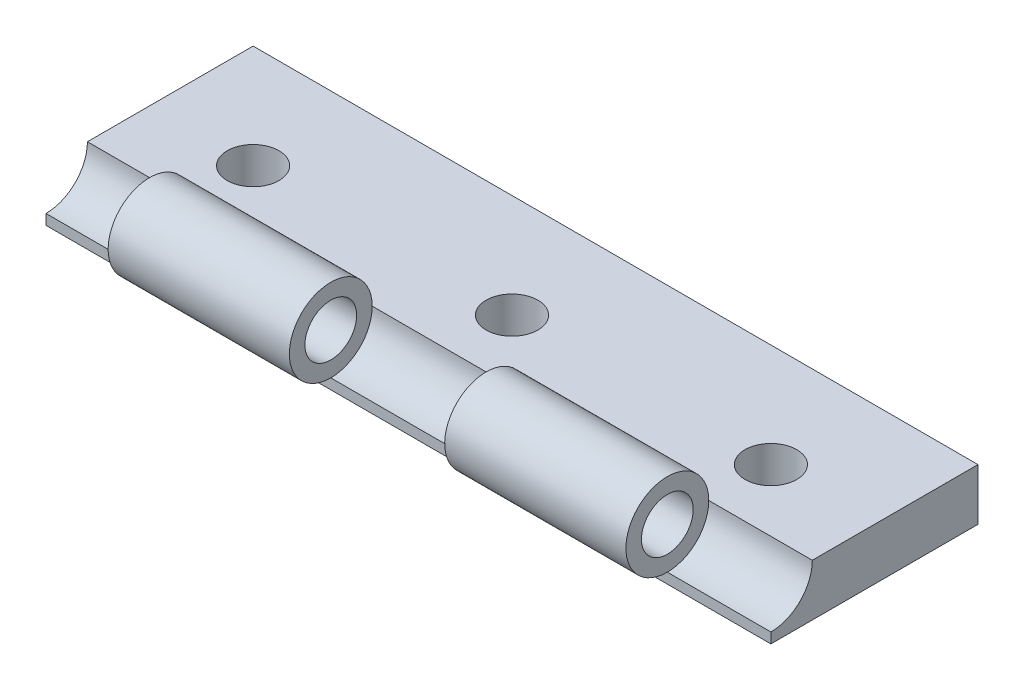
ISO-10303-21;
HEADER;
FILE_DESCRIPTION(('STEP AP214'),'2;1');
FILE_NAME('part.step','',(''),(''),'','','');
FILE_SCHEMA(('AUTOMOTIVE_DESIGN { 1 0 10303 214 1 1 1 1 }'));
ENDSEC;
DATA;
#1=APPLICATION_CONTEXT('core data for automotive mechanical design processes');
#2=APPLICATION_PROTOCOL_DEFINITION('international standard','automotive_design',2000,#1);
#3=PRODUCT_CONTEXT('',#1,'mechanical');
#4=PRODUCT('Part','Part','',(#3));
#5=PRODUCT_RELATED_PRODUCT_CATEGORY('part','',(#4));
#6=PRODUCT_DEFINITION_FORMATION('','',#4);
#7=PRODUCT_DEFINITION_CONTEXT('part definition',#1,'design');
#8=PRODUCT_DEFINITION('design','',#6,#7);
#9=PRODUCT_DEFINITION_SHAPE('','',#8);
#10=(LENGTH_UNIT() NAMED_UNIT(*) SI_UNIT(.MILLI.,.METRE.));
#11=(NAMED_UNIT(*) PLANE_ANGLE_UNIT() SI_UNIT($,.RADIAN.));
#12=(NAMED_UNIT(*) SI_UNIT($,.STERADIAN.) SOLID_ANGLE_UNIT());
#13=UNCERTAINTY_MEASURE_WITH_UNIT(LENGTH_MEASURE(1.E-05),#10,'distance_accuracy_value','');
#14=(GEOMETRIC_REPRESENTATION_CONTEXT(3) GLOBAL_UNCERTAINTY_ASSIGNED_CONTEXT((#13)) GLOBAL_UNIT_ASSIGNED_CONTEXT((#10,
#11,#12)) REPRESENTATION_CONTEXT('',''));
#15=CARTESIAN_POINT('',(0.,0.,0.));
#16=DIRECTION('',(0.,0.,1.));
#17=DIRECTION('',(1.,0.,0.));
#18=AXIS2_PLACEMENT_3D('',#15,#16,#17);
#19=CARTESIAN_POINT('',(44.45,6.35,0.));
#20=DIRECTION('',(-1.,0.,0.));
#21=DIRECTION('',(0.,0.,1.));
#22=AXIS2_PLACEMENT_3D('',#19,#20,#21);
#23=CYLINDRICAL_SURFACE('',#22,5.08);
#24=CARTESIAN_POINT('',(-9.525,6.35,0.));
#25=DIRECTION('',(1.,0.,0.));
#26=DIRECTION('',(0.,0.,-1.));
#27=AXIS2_PLACEMENT_3D('',#24,#25,#26);
#28=CIRCLE('',#27,5.08);
#29=CARTESIAN_POINT('',(-9.525,1.27,0.));
#30=VERTEX_POINT('',#29);
#31=CARTESIAN_POINT('',(-9.525,6.35,-5.07999999999998));
#32=VERTEX_POINT('',#31);
#33=EDGE_CURVE('E202',#30,#32,#28,.T.);
#34=ORIENTED_EDGE('',*,*,#33,.F.);
#35=DIRECTION('',(-1.,0.,0.));
#36=VECTOR('',#35,1.);
#37=CARTESIAN_POINT('',(44.45,1.27,0.));
#38=LINE('',#37,#36);
#39=CARTESIAN_POINT('',(9.525,1.27,0.));
#40=VERTEX_POINT('',#39);
#41=EDGE_CURVE('E195',#40,#30,#38,.T.);
#42=ORIENTED_EDGE('',*,*,#41,.F.);
#43=CARTESIAN_POINT('',(9.525,6.35,0.));
#44=DIRECTION('',(1.,0.,0.));
#45=DIRECTION('',(0.,0.,-1.));
#46=AXIS2_PLACEMENT_3D('',#43,#44,#45);
#47=CIRCLE('',#46,5.08);
#48=CARTESIAN_POINT('',(9.525,6.35,-5.07999999999998));
#49=VERTEX_POINT('',#48);
#50=EDGE_CURVE('E47',#49,#40,#47,.F.);
#51=ORIENTED_EDGE('',*,*,#50,.F.);
#52=DIRECTION('',(-1.,0.,0.));
#53=VECTOR('',#52,1.);
#54=CARTESIAN_POINT('',(44.45,6.35,-5.07999999999998));
#55=LINE('',#54,#53);
#56=EDGE_CURVE('E137',#49,#32,#55,.T.);
#57=ORIENTED_EDGE('',*,*,#56,.T.);
#58=EDGE_LOOP('',(#34,#42,#51,#57));
#59=FACE_BOUND('',#58,.T.);
#60=ADVANCED_FACE('F39',(#59),#23,.F.);
#61=CARTESIAN_POINT('',(-31.75,1.27,0.));
#62=VERTEX_POINT('',#61);
#63=CARTESIAN_POINT('',(-44.45,1.27,0.));
#64=VERTEX_POINT('',#63);
#65=EDGE_CURVE('E129',#62,#64,#38,.T.);
#66=ORIENTED_EDGE('',*,*,#65,.F.);
#67=CARTESIAN_POINT('',(-31.75,6.35,0.));
#68=DIRECTION('',(1.,0.,0.));
#69=DIRECTION('',(0.,0.,-1.));
#70=AXIS2_PLACEMENT_3D('',#67,#68,#69);
#71=CIRCLE('',#70,5.08);
#72=CARTESIAN_POINT('',(-31.75,6.35,-5.07999999999998));
#73=VERTEX_POINT('',#72);
#74=EDGE_CURVE('E121',#62,#73,#71,.T.);
#75=ORIENTED_EDGE('',*,*,#74,.T.);
#76=CARTESIAN_POINT('',(-44.45,6.35,-5.08));
#77=VERTEX_POINT('',#76);
#78=EDGE_CURVE('E127',#73,#77,#55,.T.);
#79=ORIENTED_EDGE('',*,*,#78,.T.);
#80=CARTESIAN_POINT('',(-44.45,6.35,0.));
#81=DIRECTION('',(-1.,0.,0.));
#82=DIRECTION('',(0.,0.,1.));
#83=AXIS2_PLACEMENT_3D('',#80,#81,#82);
#84=CIRCLE('',#83,5.08);
#85=EDGE_CURVE('E143',#77,#64,#84,.T.);
#86=ORIENTED_EDGE('',*,*,#85,.T.);
#87=EDGE_LOOP('',(#66,#75,#79,#86));
#88=FACE_BOUND('',#87,.T.);
#89=ADVANCED_FACE('F125',(#88),#23,.F.);
#90=CARTESIAN_POINT('',(0.,6.35,0.));
#91=DIRECTION('',(0.,1.,0.));
#92=DIRECTION('',(0.,0.,1.));
#93=AXIS2_PLACEMENT_3D('',#90,#91,#92);
#94=PLANE('',#93);
#95=CARTESIAN_POINT('',(44.45,6.35,-5.07999999999998));
#96=VERTEX_POINT('',#95);
#97=CARTESIAN_POINT('',(31.75,6.35,-5.07999999999998));
#98=VERTEX_POINT('',#97);
#99=EDGE_CURVE('E140',#96,#98,#55,.T.);
#100=ORIENTED_EDGE('',*,*,#99,.F.);
#101=DIRECTION('',(0.,0.,-1.));
#102=VECTOR('',#101,1.);
#103=CARTESIAN_POINT('',(44.45,6.35,-25.4));
#104=LINE('',#103,#102);
#105=CARTESIAN_POINT('',(44.45,6.35,-25.4));
#106=VERTEX_POINT('',#105);
#107=EDGE_CURVE('E280',#96,#106,#104,.T.);
#108=ORIENTED_EDGE('',*,*,#107,.T.);
#109=DIRECTION('',(-1.,0.,0.));
#110=VECTOR('',#109,1.);
#111=CARTESIAN_POINT('',(-44.45,6.35,-25.4));
#112=LINE('',#111,#110);
#113=CARTESIAN_POINT('',(-44.45,6.35,-25.4));
#114=VERTEX_POINT('',#113);
#115=EDGE_CURVE('E285',#106,#114,#112,.T.);
#116=ORIENTED_EDGE('',*,*,#115,.T.);
#117=DIRECTION('',(0.,0.,1.));
#118=VECTOR('',#117,1.);
#119=CARTESIAN_POINT('',(-44.45,6.35,-25.4));
#120=LINE('',#119,#118);
#121=EDGE_CURVE('E136',#114,#77,#120,.T.);
#122=ORIENTED_EDGE('',*,*,#121,.T.);
#123=ORIENTED_EDGE('',*,*,#78,.F.);
#124=DIRECTION('',(1.,0.,0.));
#125=VECTOR('',#124,1.);
#126=CARTESIAN_POINT('',(-31.75,6.35,-5.07999999999998));
#127=LINE('',#126,#125);
#128=EDGE_CURVE('E108',#32,#73,#127,.F.);
#129=ORIENTED_EDGE('',*,*,#128,.F.);
#130=ORIENTED_EDGE('',*,*,#56,.F.);
#131=EDGE_CURVE('E141',#98,#49,#55,.T.);
#132=ORIENTED_EDGE('',*,*,#131,.F.);
#133=EDGE_LOOP('',(#100,#108,#116,#122,#123,#129,#130,#132));
#134=FACE_BOUND('',#133,.T.);
#135=CARTESIAN_POINT('',(0.,6.35,-12.7));
#136=DIRECTION('',(0.,1.,0.));
#137=DIRECTION('',(0.,0.,1.));
#138=AXIS2_PLACEMENT_3D('',#135,#136,#137);
#139=CIRCLE('',#138,3.175);
#140=CARTESIAN_POINT('',(0.,6.35,-9.525));
#141=VERTEX_POINT('',#140);
#142=EDGE_CURVE('E291',#141,#141,#139,.T.);
#143=ORIENTED_EDGE('',*,*,#142,.F.);
#144=EDGE_LOOP('',(#143));
#145=FACE_BOUND('',#144,.T.);
#146=CARTESIAN_POINT('',(-31.75,6.35,-12.7));
#147=DIRECTION('',(0.,1.,0.));
#148=DIRECTION('',(0.,0.,1.));
#149=AXIS2_PLACEMENT_3D('',#146,#147,#148);
#150=CIRCLE('',#149,3.175);
#151=CARTESIAN_POINT('',(-31.75,6.35,-9.525));
#152=VERTEX_POINT('',#151);
#153=EDGE_CURVE('E283',#152,#152,#150,.T.);
#154=ORIENTED_EDGE('',*,*,#153,.F.);
#155=EDGE_LOOP('',(#154));
#156=FACE_BOUND('',#155,.T.);
#157=CARTESIAN_POINT('',(31.75,6.35,-12.7));
#158=DIRECTION('',(0.,1.,0.));
#159=DIRECTION('',(0.,0.,1.));
#160=AXIS2_PLACEMENT_3D('',#157,#158,#159);
#161=CIRCLE('',#160,3.175);
#162=CARTESIAN_POINT('',(31.75,6.35,-9.525));
#163=VERTEX_POINT('',#162);
#164=EDGE_CURVE('E149',#163,#163,#161,.T.);
#165=ORIENTED_EDGE('',*,*,#164,.F.);
#166=EDGE_LOOP('',(#165));
#167=FACE_BOUND('',#166,.T.);
#168=ADVANCED_FACE('F133',(#134,#145,#156,#167),#94,.T.);
#169=CARTESIAN_POINT('',(0.,0.,0.));
#170=DIRECTION('',(0.,1.,0.));
#171=DIRECTION('',(0.,0.,1.));
#172=AXIS2_PLACEMENT_3D('',#169,#170,#171);
#173=PLANE('',#172);
#174=DIRECTION('',(0.,0.,-1.));
#175=VECTOR('',#174,1.);
#176=CARTESIAN_POINT('',(44.45,0.,-25.4));
#177=LINE('',#176,#175);
#178=CARTESIAN_POINT('',(44.45,0.,0.));
#179=VERTEX_POINT('',#178);
#180=CARTESIAN_POINT('',(44.45,0.,-25.4));
#181=VERTEX_POINT('',#180);
#182=EDGE_CURVE('E275',#179,#181,#177,.T.);
#183=ORIENTED_EDGE('',*,*,#182,.F.);
#184=DIRECTION('',(1.,0.,0.));
#185=VECTOR('',#184,1.);
#186=CARTESIAN_POINT('',(-44.45,0.,0.));
#187=LINE('',#186,#185);
#188=CARTESIAN_POINT('',(-44.45,0.,0.));
#189=VERTEX_POINT('',#188);
#190=EDGE_CURVE('E278',#189,#179,#187,.T.);
#191=ORIENTED_EDGE('',*,*,#190,.F.);
#192=DIRECTION('',(0.,0.,1.));
#193=VECTOR('',#192,1.);
#194=CARTESIAN_POINT('',(-44.45,0.,-25.4));
#195=LINE('',#194,#193);
#196=CARTESIAN_POINT('',(-44.45,0.,-25.4));
#197=VERTEX_POINT('',#196);
#198=EDGE_CURVE('E178',#197,#189,#195,.T.);
#199=ORIENTED_EDGE('',*,*,#198,.F.);
#200=DIRECTION('',(-1.,0.,0.));
#201=VECTOR('',#200,1.);
#202=CARTESIAN_POINT('',(-44.45,0.,-25.4));
#203=LINE('',#202,#201);
#204=EDGE_CURVE('E270',#181,#197,#203,.T.);
#205=ORIENTED_EDGE('',*,*,#204,.F.);
#206=EDGE_LOOP('',(#183,#191,#199,#205));
#207=FACE_BOUND('',#206,.T.);
#208=CARTESIAN_POINT('',(-31.75,0.,-12.7));
#209=DIRECTION('',(0.,1.,0.));
#210=DIRECTION('',(0.,0.,1.));
#211=AXIS2_PLACEMENT_3D('',#208,#209,#210);
#212=CIRCLE('',#211,3.175);
#213=CARTESIAN_POINT('',(-31.75,0.,-9.525));
#214=VERTEX_POINT('',#213);
#215=EDGE_CURVE('E288',#214,#214,#212,.T.);
#216=ORIENTED_EDGE('',*,*,#215,.T.);
#217=EDGE_LOOP('',(#216));
#218=FACE_BOUND('',#217,.T.);
#219=CARTESIAN_POINT('',(0.,0.,-12.7));
#220=DIRECTION('',(0.,1.,0.));
#221=DIRECTION('',(0.,0.,1.));
#222=AXIS2_PLACEMENT_3D('',#219,#220,#221);
#223=CIRCLE('',#222,3.175);
#224=CARTESIAN_POINT('',(0.,0.,-9.525));
#225=VERTEX_POINT('',#224);
#226=EDGE_CURVE('E294',#225,#225,#223,.T.);
#227=ORIENTED_EDGE('',*,*,#226,.T.);
#228=EDGE_LOOP('',(#227));
#229=FACE_BOUND('',#228,.T.);
#230=CARTESIAN_POINT('',(31.75,0.,-12.7));
#231=DIRECTION('',(0.,1.,0.));
#232=DIRECTION('',(0.,0.,1.));
#233=AXIS2_PLACEMENT_3D('',#230,#231,#232);
#234=CIRCLE('',#233,3.175);
#235=CARTESIAN_POINT('',(31.75,0.,-9.525));
#236=VERTEX_POINT('',#235);
#237=EDGE_CURVE('E147',#236,#236,#234,.T.);
#238=ORIENTED_EDGE('',*,*,#237,.T.);
#239=EDGE_LOOP('',(#238));
#240=FACE_BOUND('',#239,.T.);
#241=ADVANCED_FACE('F257',(#207,#218,#229,#240),#173,.F.);
#242=CARTESIAN_POINT('',(44.45,6.35,-25.4));
#243=DIRECTION('',(-1.,0.,0.));
#244=DIRECTION('',(0.,0.,1.));
#245=AXIS2_PLACEMENT_3D('',#242,#243,#244);
#246=PLANE('',#245);
#247=ORIENTED_EDGE('',*,*,#107,.F.);
#248=CARTESIAN_POINT('',(44.45,6.35,0.));
#249=DIRECTION('',(-1.,0.,0.));
#250=DIRECTION('',(0.,0.,1.));
#251=AXIS2_PLACEMENT_3D('',#248,#249,#250);
#252=CIRCLE('',#251,5.08);
#253=CARTESIAN_POINT('',(44.45,1.27,0.));
#254=VERTEX_POINT('',#253);
#255=EDGE_CURVE('E138',#96,#254,#252,.T.);
#256=ORIENTED_EDGE('',*,*,#255,.T.);
#257=DIRECTION('',(0.,-1.,0.));
#258=VECTOR('',#257,1.);
#259=CARTESIAN_POINT('',(44.45,6.35,0.));
#260=LINE('',#259,#258);
#261=EDGE_CURVE('E183',#254,#179,#260,.T.);
#262=ORIENTED_EDGE('',*,*,#261,.T.);
#263=ORIENTED_EDGE('',*,*,#182,.T.);
#264=DIRECTION('',(0.,-1.,0.));
#265=VECTOR('',#264,1.);
#266=CARTESIAN_POINT('',(44.45,6.35,-25.4));
#267=LINE('',#266,#265);
#268=EDGE_CURVE('E185',#106,#181,#267,.T.);
#269=ORIENTED_EDGE('',*,*,#268,.F.);
#270=EDGE_LOOP('',(#247,#256,#262,#263,#269));
#271=FACE_BOUND('',#270,.T.);
#272=ADVANCED_FACE('F41',(#271),#246,.F.);
#273=CARTESIAN_POINT('',(-44.45,6.35,-25.4));
#274=DIRECTION('',(0.,0.,1.));
#275=DIRECTION('',(1.,0.,0.));
#276=AXIS2_PLACEMENT_3D('',#273,#274,#275);
#277=PLANE('',#276);
#278=ORIENTED_EDGE('',*,*,#204,.T.);
#279=DIRECTION('',(0.,-1.,0.));
#280=VECTOR('',#279,1.);
#281=CARTESIAN_POINT('',(-44.45,6.35,-25.4));
#282=LINE('',#281,#280);
#283=EDGE_CURVE('E182',#114,#197,#282,.T.);
#284=ORIENTED_EDGE('',*,*,#283,.F.);
#285=ORIENTED_EDGE('',*,*,#115,.F.);
#286=ORIENTED_EDGE('',*,*,#268,.T.);
#287=EDGE_LOOP('',(#278,#284,#285,#286));
#288=FACE_BOUND('',#287,.T.);
#289=ADVANCED_FACE('F263',(#288),#277,.F.);
#290=CARTESIAN_POINT('',(-44.45,6.35,-25.4));
#291=DIRECTION('',(1.,0.,0.));
#292=DIRECTION('',(0.,0.,-1.));
#293=AXIS2_PLACEMENT_3D('',#290,#291,#292);
#294=PLANE('',#293);
#295=DIRECTION('',(0.,-1.,0.));
#296=VECTOR('',#295,1.);
#297=CARTESIAN_POINT('',(-44.45,6.35,0.));
#298=LINE('',#297,#296);
#299=EDGE_CURVE('E174',#64,#189,#298,.T.);
#300=ORIENTED_EDGE('',*,*,#299,.F.);
#301=ORIENTED_EDGE('',*,*,#85,.F.);
#302=ORIENTED_EDGE('',*,*,#121,.F.);
#303=ORIENTED_EDGE('',*,*,#283,.T.);
#304=ORIENTED_EDGE('',*,*,#198,.T.);
#305=EDGE_LOOP('',(#300,#301,#302,#303,#304));
#306=FACE_BOUND('',#305,.T.);
#307=ADVANCED_FACE('F175',(#306),#294,.F.);
#308=CARTESIAN_POINT('',(-44.45,6.35,0.));
#309=DIRECTION('',(0.,0.,-1.));
#310=DIRECTION('',(-1.,0.,0.));
#311=AXIS2_PLACEMENT_3D('',#308,#309,#310);
#312=PLANE('',#311);
#313=ORIENTED_EDGE('',*,*,#261,.F.);
#314=CARTESIAN_POINT('',(31.75,1.27,0.));
#315=VERTEX_POINT('',#314);
#316=EDGE_CURVE('E192',#254,#315,#38,.T.);
#317=ORIENTED_EDGE('',*,*,#316,.T.);
#318=EDGE_CURVE('E193',#315,#40,#38,.T.);
#319=ORIENTED_EDGE('',*,*,#318,.T.);
#320=ORIENTED_EDGE('',*,*,#41,.T.);
#321=EDGE_CURVE('E196',#30,#62,#38,.T.);
#322=ORIENTED_EDGE('',*,*,#321,.T.);
#323=ORIENTED_EDGE('',*,*,#65,.T.);
#324=ORIENTED_EDGE('',*,*,#299,.T.);
#325=ORIENTED_EDGE('',*,*,#190,.T.);
#326=EDGE_LOOP('',(#313,#317,#319,#320,#322,#323,#324,#325));
#327=FACE_BOUND('',#326,.T.);
#328=ADVANCED_FACE('F199',(#327),#312,.F.);
#329=CARTESIAN_POINT('',(-31.75,6.35,-12.7));
#330=DIRECTION('',(0.,-1.,0.));
#331=DIRECTION('',(0.,0.,-1.));
#332=AXIS2_PLACEMENT_3D('',#329,#330,#331);
#333=CYLINDRICAL_SURFACE('',#332,3.175);
#334=ORIENTED_EDGE('',*,*,#153,.T.);
#335=EDGE_LOOP('',(#334));
#336=FACE_BOUND('',#335,.T.);
#337=ORIENTED_EDGE('',*,*,#215,.F.);
#338=EDGE_LOOP('',(#337));
#339=FACE_BOUND('',#338,.T.);
#340=ADVANCED_FACE('F246',(#336,#339),#333,.F.);
#341=CARTESIAN_POINT('',(0.,6.35,-12.7));
#342=DIRECTION('',(0.,-1.,0.));
#343=DIRECTION('',(0.,0.,-1.));
#344=AXIS2_PLACEMENT_3D('',#341,#342,#343);
#345=CYLINDRICAL_SURFACE('',#344,3.175);
#346=ORIENTED_EDGE('',*,*,#142,.T.);
#347=EDGE_LOOP('',(#346));
#348=FACE_BOUND('',#347,.T.);
#349=ORIENTED_EDGE('',*,*,#226,.F.);
#350=EDGE_LOOP('',(#349));
#351=FACE_BOUND('',#350,.T.);
#352=ADVANCED_FACE('F240',(#348,#351),#345,.F.);
#353=CARTESIAN_POINT('',(31.75,6.35,-12.7));
#354=DIRECTION('',(0.,-1.,0.));
#355=DIRECTION('',(0.,0.,-1.));
#356=AXIS2_PLACEMENT_3D('',#353,#354,#355);
#357=CYLINDRICAL_SURFACE('',#356,3.175);
#358=ORIENTED_EDGE('',*,*,#164,.T.);
#359=EDGE_LOOP('',(#358));
#360=FACE_BOUND('',#359,.T.);
#361=ORIENTED_EDGE('',*,*,#237,.F.);
#362=EDGE_LOOP('',(#361));
#363=FACE_BOUND('',#362,.T.);
#364=ADVANCED_FACE('F233',(#360,#363),#357,.F.);
#365=ORIENTED_EDGE('',*,*,#99,.T.);
#366=CARTESIAN_POINT('',(31.75,6.35,0.));
#367=DIRECTION('',(1.,0.,0.));
#368=DIRECTION('',(0.,0.,-1.));
#369=AXIS2_PLACEMENT_3D('',#366,#367,#368);
#370=CIRCLE('',#369,5.08);
#371=EDGE_CURVE('E11',#98,#315,#370,.F.);
#372=ORIENTED_EDGE('',*,*,#371,.T.);
#373=ORIENTED_EDGE('',*,*,#316,.F.);
#374=ORIENTED_EDGE('',*,*,#255,.F.);
#375=EDGE_LOOP('',(#365,#372,#373,#374));
#376=FACE_BOUND('',#375,.T.);
#377=ADVANCED_FACE('F226',(#376),#23,.F.);
#378=CARTESIAN_POINT('',(31.75,6.35,0.));
#379=DIRECTION('',(1.,0.,0.));
#380=DIRECTION('',(0.,0.,-1.));
#381=AXIS2_PLACEMENT_3D('',#378,#379,#380);
#382=PLANE('',#381);
#383=CARTESIAN_POINT('',(31.75,6.35,0.));
#384=DIRECTION('',(1.,0.,0.));
#385=DIRECTION('',(0.,0.,-1.));
#386=AXIS2_PLACEMENT_3D('',#383,#384,#385);
#387=CIRCLE('',#386,5.08);
#388=EDGE_CURVE('E160',#98,#315,#387,.T.);
#389=ORIENTED_EDGE('',*,*,#388,.T.);
#390=ORIENTED_EDGE('',*,*,#371,.F.);
#391=EDGE_LOOP('',(#389,#390));
#392=FACE_BOUND('',#391,.T.);
#393=CARTESIAN_POINT('',(31.75,6.35,0.));
#394=DIRECTION('',(1.,0.,0.));
#395=DIRECTION('',(0.,0.,-1.));
#396=AXIS2_PLACEMENT_3D('',#393,#394,#395);
#397=CIRCLE('',#396,3.175);
#398=CARTESIAN_POINT('',(31.75,6.35,-3.17499999999997));
#399=VERTEX_POINT('',#398);
#400=EDGE_CURVE('E165',#399,#399,#397,.T.);
#401=ORIENTED_EDGE('',*,*,#400,.F.);
#402=EDGE_LOOP('',(#401));
#403=FACE_BOUND('',#402,.T.);
#404=ADVANCED_FACE('F232',(#392,#403),#382,.T.);
#405=CARTESIAN_POINT('',(9.525,6.35,0.));
#406=DIRECTION('',(1.,0.,0.));
#407=DIRECTION('',(0.,0.,-1.));
#408=AXIS2_PLACEMENT_3D('',#405,#406,#407);
#409=PLANE('',#408);
#410=CARTESIAN_POINT('',(9.525,6.35,0.));
#411=DIRECTION('',(1.,0.,0.));
#412=DIRECTION('',(0.,0.,-1.));
#413=AXIS2_PLACEMENT_3D('',#410,#411,#412);
#414=CIRCLE('',#413,5.08);
#415=EDGE_CURVE('E158',#49,#40,#414,.T.);
#416=ORIENTED_EDGE('',*,*,#415,.F.);
#417=ORIENTED_EDGE('',*,*,#50,.T.);
#418=EDGE_LOOP('',(#416,#417));
#419=FACE_BOUND('',#418,.T.);
#420=CARTESIAN_POINT('',(9.525,6.35,0.));
#421=DIRECTION('',(1.,0.,0.));
#422=DIRECTION('',(0.,0.,-1.));
#423=AXIS2_PLACEMENT_3D('',#420,#421,#422);
#424=CIRCLE('',#423,3.175);
#425=CARTESIAN_POINT('',(9.525,6.35,-3.17499999999997));
#426=VERTEX_POINT('',#425);
#427=EDGE_CURVE('E116',#426,#426,#424,.T.);
#428=ORIENTED_EDGE('',*,*,#427,.T.);
#429=EDGE_LOOP('',(#428));
#430=FACE_BOUND('',#429,.T.);
#431=ADVANCED_FACE('F163',(#419,#430),#409,.F.);
#432=CARTESIAN_POINT('',(31.75,6.35,0.));
#433=DIRECTION('',(-1.,0.,0.));
#434=DIRECTION('',(0.,0.,1.));
#435=AXIS2_PLACEMENT_3D('',#432,#433,#434);
#436=CYLINDRICAL_SURFACE('',#435,5.08);
#437=ORIENTED_EDGE('',*,*,#131,.T.);
#438=ORIENTED_EDGE('',*,*,#415,.T.);
#439=ORIENTED_EDGE('',*,*,#318,.F.);
#440=ORIENTED_EDGE('',*,*,#388,.F.);
#441=EDGE_LOOP('',(#437,#438,#439,#440));
#442=FACE_BOUND('',#441,.T.);
#443=ADVANCED_FACE('F156',(#442),#436,.T.);
#444=CARTESIAN_POINT('',(31.75,6.35,0.));
#445=DIRECTION('',(-1.,0.,0.));
#446=DIRECTION('',(0.,0.,1.));
#447=AXIS2_PLACEMENT_3D('',#444,#445,#446);
#448=CYLINDRICAL_SURFACE('',#447,3.175);
#449=ORIENTED_EDGE('',*,*,#400,.T.);
#450=EDGE_LOOP('',(#449));
#451=FACE_BOUND('',#450,.T.);
#452=ORIENTED_EDGE('',*,*,#427,.F.);
#453=EDGE_LOOP('',(#452));
#454=FACE_BOUND('',#453,.T.);
#455=ADVANCED_FACE('F213',(#451,#454),#448,.F.);
#456=CARTESIAN_POINT('',(-31.75,6.35,0.));
#457=DIRECTION('',(1.,0.,0.));
#458=DIRECTION('',(0.,0.,-1.));
#459=AXIS2_PLACEMENT_3D('',#456,#457,#458);
#460=CYLINDRICAL_SURFACE('',#459,5.08);
#461=EDGE_CURVE('E111',#32,#30,#28,.T.);
#462=ORIENTED_EDGE('',*,*,#461,.F.);
#463=ORIENTED_EDGE('',*,*,#128,.T.);
#464=EDGE_CURVE('E54',#73,#62,#71,.T.);
#465=ORIENTED_EDGE('',*,*,#464,.T.);
#466=ORIENTED_EDGE('',*,*,#321,.F.);
#467=EDGE_LOOP('',(#462,#463,#465,#466));
#468=FACE_BOUND('',#467,.T.);
#469=ADVANCED_FACE('F109',(#468),#460,.T.);
#470=CARTESIAN_POINT('',(-31.75,6.35,0.));
#471=DIRECTION('',(-1.,0.,0.));
#472=DIRECTION('',(0.,0.,-1.));
#473=AXIS2_PLACEMENT_3D('',#470,#471,#472);
#474=PLANE('',#473);
#475=CARTESIAN_POINT('',(-31.75,6.35,0.));
#476=DIRECTION('',(1.,0.,0.));
#477=DIRECTION('',(0.,0.,-1.));
#478=AXIS2_PLACEMENT_3D('',#475,#476,#477);
#479=CIRCLE('',#478,3.175);
#480=CARTESIAN_POINT('',(-31.75,6.35,-3.17499999999997));
#481=VERTEX_POINT('',#480);
#482=EDGE_CURVE('E204',#481,#481,#479,.T.);
#483=ORIENTED_EDGE('',*,*,#482,.T.);
#484=EDGE_LOOP('',(#483));
#485=FACE_BOUND('',#484,.T.);
#486=ORIENTED_EDGE('',*,*,#464,.F.);
#487=ORIENTED_EDGE('',*,*,#74,.F.);
#488=EDGE_LOOP('',(#486,#487));
#489=FACE_BOUND('',#488,.T.);
#490=ADVANCED_FACE('F120',(#485,#489),#474,.T.);
#491=CARTESIAN_POINT('',(-9.525,6.35,0.));
#492=DIRECTION('',(-1.,0.,0.));
#493=DIRECTION('',(0.,0.,-1.));
#494=AXIS2_PLACEMENT_3D('',#491,#492,#493);
#495=PLANE('',#494);
#496=CARTESIAN_POINT('',(-9.525,6.35,0.));
#497=DIRECTION('',(1.,0.,0.));
#498=DIRECTION('',(0.,0.,-1.));
#499=AXIS2_PLACEMENT_3D('',#496,#497,#498);
#500=CIRCLE('',#499,3.175);
#501=CARTESIAN_POINT('',(-9.525,6.35,-3.17499999999997));
#502=VERTEX_POINT('',#501);
#503=EDGE_CURVE('E207',#502,#502,#500,.T.);
#504=ORIENTED_EDGE('',*,*,#503,.F.);
#505=EDGE_LOOP('',(#504));
#506=FACE_BOUND('',#505,.T.);
#507=ORIENTED_EDGE('',*,*,#461,.T.);
#508=ORIENTED_EDGE('',*,*,#33,.T.);
#509=EDGE_LOOP('',(#507,#508));
#510=FACE_BOUND('',#509,.T.);
#511=ADVANCED_FACE('F397',(#506,#510),#495,.F.);
#512=CARTESIAN_POINT('',(-31.75,6.35,0.));
#513=DIRECTION('',(1.,0.,0.));
#514=DIRECTION('',(0.,0.,-1.));
#515=AXIS2_PLACEMENT_3D('',#512,#513,#514);
#516=CYLINDRICAL_SURFACE('',#515,3.175);
#517=ORIENTED_EDGE('',*,*,#482,.F.);
#518=EDGE_LOOP('',(#517));
#519=FACE_BOUND('',#518,.T.);
#520=ORIENTED_EDGE('',*,*,#503,.T.);
#521=EDGE_LOOP('',(#520));
#522=FACE_BOUND('',#521,.T.);
#523=ADVANCED_FACE('F407',(#519,#522),#516,.F.);
#524=CLOSED_SHELL('',(#60,#89,#168,#241,#272,#289,#307,#328,#340,#352,#364,#377,#404,#431,#443,
#455,#469,#490,#511,#523));
#525=MANIFOLD_SOLID_BREP('B2',#524);
#526=ADVANCED_BREP_SHAPE_REPRESENTATION('',(#18,#525),#14);
#527=SHAPE_DEFINITION_REPRESENTATION(#9,#526);
ENDSEC;
END-ISO-10303-21;
